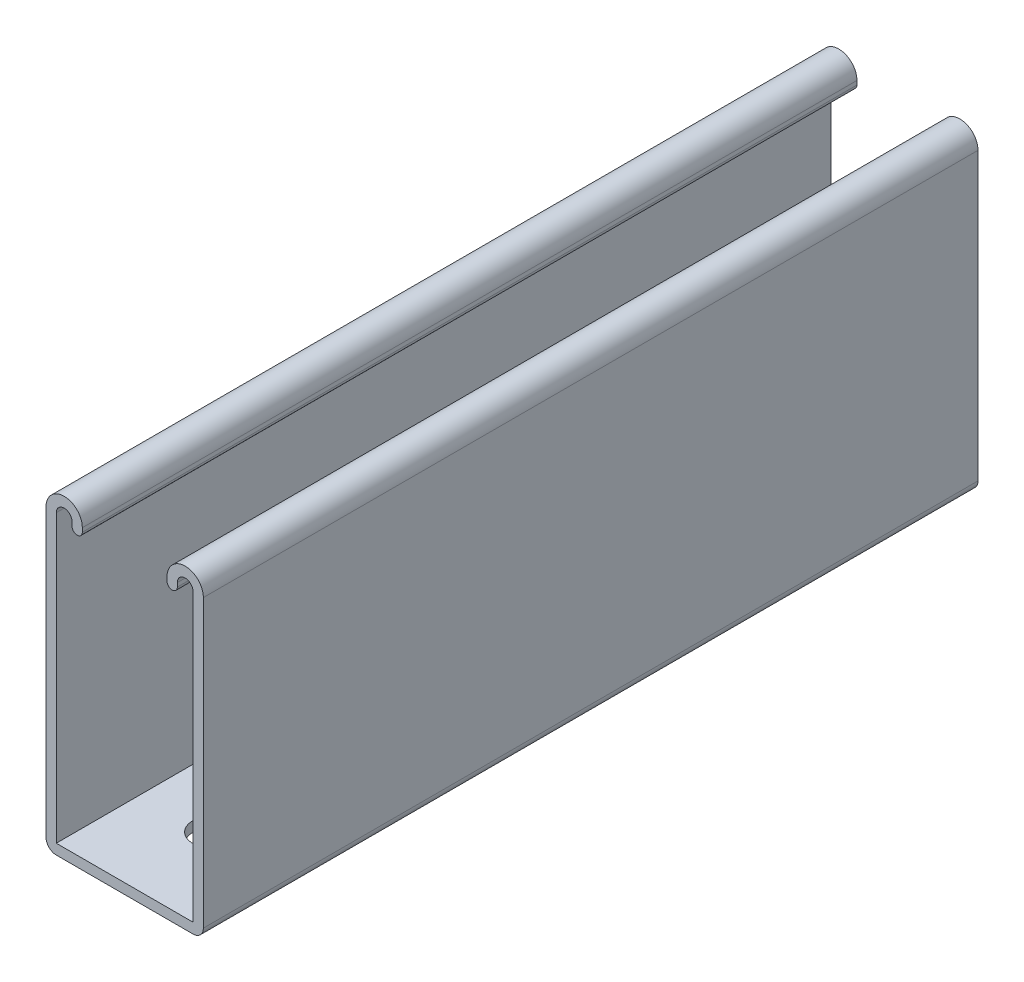
ISO-10303-21;
HEADER;
FILE_DESCRIPTION(('STEP AP214'),'2;1');
FILE_NAME('part.step','',(''),(''),'','','');
FILE_SCHEMA(('AUTOMOTIVE_DESIGN { 1 0 10303 214 1 1 1 1 }'));
ENDSEC;
DATA;
#1=APPLICATION_CONTEXT('core data for automotive mechanical design processes');
#2=APPLICATION_PROTOCOL_DEFINITION('international standard','automotive_design',2000,#1);
#3=PRODUCT_CONTEXT('',#1,'mechanical');
#4=PRODUCT('Part','Part','',(#3));
#5=PRODUCT_RELATED_PRODUCT_CATEGORY('part','',(#4));
#6=PRODUCT_DEFINITION_FORMATION('','',#4);
#7=PRODUCT_DEFINITION_CONTEXT('part definition',#1,'design');
#8=PRODUCT_DEFINITION('design','',#6,#7);
#9=PRODUCT_DEFINITION_SHAPE('','',#8);
#10=(LENGTH_UNIT() NAMED_UNIT(*) SI_UNIT(.MILLI.,.METRE.));
#11=(NAMED_UNIT(*) PLANE_ANGLE_UNIT() SI_UNIT($,.RADIAN.));
#12=(NAMED_UNIT(*) SI_UNIT($,.STERADIAN.) SOLID_ANGLE_UNIT());
#13=UNCERTAINTY_MEASURE_WITH_UNIT(LENGTH_MEASURE(1.E-05),#10,'distance_accuracy_value','');
#14=(GEOMETRIC_REPRESENTATION_CONTEXT(3) GLOBAL_UNCERTAINTY_ASSIGNED_CONTEXT((#13)) GLOBAL_UNIT_ASSIGNED_CONTEXT((#10,
#11,#12)) REPRESENTATION_CONTEXT('',''));
#15=CARTESIAN_POINT('',(0.,0.,0.));
#16=DIRECTION('',(0.,0.,1.));
#17=DIRECTION('',(1.,0.,0.));
#18=AXIS2_PLACEMENT_3D('',#15,#16,#17);
#19=CARTESIAN_POINT('',(-15.875,39.6875,203.2));
#20=DIRECTION('',(0.,0.,-1.));
#21=DIRECTION('',(-1.,0.,0.));
#22=AXIS2_PLACEMENT_3D('',#19,#20,#21);
#23=CYLINDRICAL_SURFACE('',#22,4.7625);
#24=CARTESIAN_POINT('',(-15.875,39.6875,0.));
#25=DIRECTION('',(0.,0.,1.));
#26=DIRECTION('',(-1.,0.,0.));
#27=AXIS2_PLACEMENT_3D('',#24,#25,#26);
#28=CIRCLE('',#27,4.7625);
#29=CARTESIAN_POINT('',(-11.1125,39.6875,0.));
#30=VERTEX_POINT('',#29);
#31=CARTESIAN_POINT('',(-20.6375,39.6875,0.));
#32=VERTEX_POINT('',#31);
#33=EDGE_CURVE('E253',#30,#32,#28,.T.);
#34=ORIENTED_EDGE('',*,*,#33,.T.);
#35=DIRECTION('',(0.,0.,-1.));
#36=VECTOR('',#35,1.);
#37=CARTESIAN_POINT('',(-20.6375,39.6875,203.2));
#38=LINE('',#37,#36);
#39=CARTESIAN_POINT('',(-20.6375,39.6875,203.2));
#40=VERTEX_POINT('',#39);
#41=EDGE_CURVE('E384',#40,#32,#38,.T.);
#42=ORIENTED_EDGE('',*,*,#41,.F.);
#43=CARTESIAN_POINT('',(-15.875,39.6875,203.2));
#44=DIRECTION('',(0.,0.,1.));
#45=DIRECTION('',(-1.,0.,0.));
#46=AXIS2_PLACEMENT_3D('',#43,#44,#45);
#47=CIRCLE('',#46,4.7625);
#48=CARTESIAN_POINT('',(-11.1125,39.6875,203.2));
#49=VERTEX_POINT('',#48);
#50=EDGE_CURVE('E260',#49,#40,#47,.T.);
#51=ORIENTED_EDGE('',*,*,#50,.F.);
#52=DIRECTION('',(0.,0.,-1.));
#53=VECTOR('',#52,1.);
#54=CARTESIAN_POINT('',(-11.1125,39.6875,203.2));
#55=LINE('',#54,#53);
#56=EDGE_CURVE('E298',#49,#30,#55,.T.);
#57=ORIENTED_EDGE('',*,*,#56,.T.);
#58=EDGE_LOOP('',(#34,#42,#51,#57));
#59=FACE_BOUND('',#58,.T.);
#60=ADVANCED_FACE('F32',(#59),#23,.T.);
#61=CARTESIAN_POINT('',(-20.6375,39.6875,203.2));
#62=DIRECTION('',(1.,0.,0.));
#63=DIRECTION('',(0.,1.,0.));
#64=AXIS2_PLACEMENT_3D('',#61,#62,#63);
#65=PLANE('',#64);
#66=DIRECTION('',(0.,-1.,0.));
#67=VECTOR('',#66,1.);
#68=CARTESIAN_POINT('',(-20.6375,39.6875,0.));
#69=LINE('',#68,#67);
#70=CARTESIAN_POINT('',(-20.6375,-35.4076,0.));
#71=VERTEX_POINT('',#70);
#72=EDGE_CURVE('E301',#32,#71,#69,.T.);
#73=ORIENTED_EDGE('',*,*,#72,.T.);
#74=DIRECTION('',(0.,0.,-1.));
#75=VECTOR('',#74,1.);
#76=CARTESIAN_POINT('',(-20.6375,-35.4076,203.2));
#77=LINE('',#76,#75);
#78=CARTESIAN_POINT('',(-20.6375,-35.4076,203.2));
#79=VERTEX_POINT('',#78);
#80=EDGE_CURVE('E381',#79,#71,#77,.T.);
#81=ORIENTED_EDGE('',*,*,#80,.F.);
#82=DIRECTION('',(0.,-1.,0.));
#83=VECTOR('',#82,1.);
#84=CARTESIAN_POINT('',(-20.6375,39.6875,203.2));
#85=LINE('',#84,#83);
#86=EDGE_CURVE('E263',#40,#79,#85,.T.);
#87=ORIENTED_EDGE('',*,*,#86,.F.);
#88=ORIENTED_EDGE('',*,*,#41,.T.);
#89=EDGE_LOOP('',(#73,#81,#87,#88));
#90=FACE_BOUND('',#89,.T.);
#91=ADVANCED_FACE('F425',(#90),#65,.F.);
#92=CARTESIAN_POINT('',(-17.9451,-35.4076,203.2));
#93=DIRECTION('',(0.,0.,-1.));
#94=DIRECTION('',(-1.,0.,0.));
#95=AXIS2_PLACEMENT_3D('',#92,#93,#94);
#96=CYLINDRICAL_SURFACE('',#95,2.6924);
#97=CARTESIAN_POINT('',(-17.9451,-35.4076,0.));
#98=DIRECTION('',(0.,0.,1.));
#99=DIRECTION('',(-1.,0.,0.));
#100=AXIS2_PLACEMENT_3D('',#97,#98,#99);
#101=CIRCLE('',#100,2.6924);
#102=CARTESIAN_POINT('',(-17.9451,-38.1,0.));
#103=VERTEX_POINT('',#102);
#104=EDGE_CURVE('E303',#71,#103,#101,.T.);
#105=ORIENTED_EDGE('',*,*,#104,.T.);
#106=DIRECTION('',(0.,0.,-1.));
#107=VECTOR('',#106,1.);
#108=CARTESIAN_POINT('',(-17.9451,-38.1,203.2));
#109=LINE('',#108,#107);
#110=CARTESIAN_POINT('',(-17.9451,-38.1,203.2));
#111=VERTEX_POINT('',#110);
#112=EDGE_CURVE('E378',#111,#103,#109,.T.);
#113=ORIENTED_EDGE('',*,*,#112,.F.);
#114=CARTESIAN_POINT('',(-17.9451,-35.4076,203.2));
#115=DIRECTION('',(0.,0.,1.));
#116=DIRECTION('',(-1.,0.,0.));
#117=AXIS2_PLACEMENT_3D('',#114,#115,#116);
#118=CIRCLE('',#117,2.6924);
#119=EDGE_CURVE('E266',#79,#111,#118,.T.);
#120=ORIENTED_EDGE('',*,*,#119,.F.);
#121=ORIENTED_EDGE('',*,*,#80,.T.);
#122=EDGE_LOOP('',(#105,#113,#120,#121));
#123=FACE_BOUND('',#122,.T.);
#124=ADVANCED_FACE('F430',(#123),#96,.T.);
#125=CARTESIAN_POINT('',(-17.9451,-38.1,203.2));
#126=DIRECTION('',(0.,1.,0.));
#127=DIRECTION('',(-1.,0.,0.));
#128=AXIS2_PLACEMENT_3D('',#125,#126,#127);
#129=PLANE('',#128);
#130=DIRECTION('',(0.,0.,-1.));
#131=VECTOR('',#130,1.);
#132=CARTESIAN_POINT('',(-5.15937500000001,-38.0999999999858,114.3));
#133=LINE('',#132,#131);
#134=CARTESIAN_POINT('',(-5.15937500000002,-38.1,180.18125));
#135=VERTEX_POINT('',#134);
#136=CARTESIAN_POINT('',(-5.15937500000001,-38.0999999999858,114.3));
#137=VERTEX_POINT('',#136);
#138=EDGE_CURVE('E206',#135,#137,#133,.T.);
#139=ORIENTED_EDGE('',*,*,#138,.F.);
#140=CARTESIAN_POINT('',(0.,-38.0999999999858,180.18125));
#141=DIRECTION('',(0.,-1.,0.));
#142=DIRECTION('',(1.,0.,0.));
#143=AXIS2_PLACEMENT_3D('',#140,#141,#142);
#144=CIRCLE('',#143,5.159375);
#145=CARTESIAN_POINT('',(5.15937499999999,-38.0999999999858,180.18125));
#146=VERTEX_POINT('',#145);
#147=EDGE_CURVE('E46',#146,#135,#144,.T.);
#148=ORIENTED_EDGE('',*,*,#147,.F.);
#149=DIRECTION('',(0.,0.,1.));
#150=VECTOR('',#149,1.);
#151=CARTESIAN_POINT('',(5.15937499999999,-38.0999999999858,180.18125));
#152=LINE('',#151,#150);
#153=CARTESIAN_POINT('',(5.159375,-38.0999999999858,114.3));
#154=VERTEX_POINT('',#153);
#155=EDGE_CURVE('E222',#154,#146,#152,.T.);
#156=ORIENTED_EDGE('',*,*,#155,.F.);
#157=CARTESIAN_POINT('',(0.,-38.0999999999858,114.3));
#158=DIRECTION('',(0.,-1.,0.));
#159=DIRECTION('',(1.,0.,0.));
#160=AXIS2_PLACEMENT_3D('',#157,#158,#159);
#161=CIRCLE('',#160,5.159375);
#162=EDGE_CURVE('E216',#137,#154,#161,.T.);
#163=ORIENTED_EDGE('',*,*,#162,.F.);
#164=EDGE_LOOP('',(#139,#148,#156,#163));
#165=FACE_BOUND('',#164,.T.);
#166=DIRECTION('',(0.,0.,-1.));
#167=VECTOR('',#166,1.);
#168=CARTESIAN_POINT('',(-5.15937500000001,-38.0999999999858,12.7));
#169=LINE('',#168,#167);
#170=CARTESIAN_POINT('',(-5.15937500000002,-38.1,78.58125));
#171=VERTEX_POINT('',#170);
#172=CARTESIAN_POINT('',(-5.15937500000001,-38.0999999999858,12.7));
#173=VERTEX_POINT('',#172);
#174=EDGE_CURVE('E241',#171,#173,#169,.T.);
#175=ORIENTED_EDGE('',*,*,#174,.F.);
#176=CARTESIAN_POINT('',(0.,-38.0999999999858,78.58125));
#177=DIRECTION('',(0.,-1.,0.));
#178=DIRECTION('',(1.,0.,0.));
#179=AXIS2_PLACEMENT_3D('',#176,#177,#178);
#180=CIRCLE('',#179,5.159375);
#181=CARTESIAN_POINT('',(5.15937499999999,-38.0999999999858,78.58125));
#182=VERTEX_POINT('',#181);
#183=EDGE_CURVE('E239',#182,#171,#180,.T.);
#184=ORIENTED_EDGE('',*,*,#183,.F.);
#185=DIRECTION('',(0.,0.,1.));
#186=VECTOR('',#185,1.);
#187=CARTESIAN_POINT('',(5.15937499999999,-38.0999999999858,78.58125));
#188=LINE('',#187,#186);
#189=CARTESIAN_POINT('',(5.159375,-38.0999999999858,12.7));
#190=VERTEX_POINT('',#189);
#191=EDGE_CURVE('E247',#190,#182,#188,.T.);
#192=ORIENTED_EDGE('',*,*,#191,.F.);
#193=CARTESIAN_POINT('',(0.,-38.0999999999858,12.7));
#194=DIRECTION('',(0.,-1.,0.));
#195=DIRECTION('',(1.,0.,0.));
#196=AXIS2_PLACEMENT_3D('',#193,#194,#195);
#197=CIRCLE('',#196,5.159375);
#198=EDGE_CURVE('E244',#173,#190,#197,.T.);
#199=ORIENTED_EDGE('',*,*,#198,.F.);
#200=EDGE_LOOP('',(#175,#184,#192,#199));
#201=FACE_BOUND('',#200,.T.);
#202=DIRECTION('',(1.,0.,0.));
#203=VECTOR('',#202,1.);
#204=CARTESIAN_POINT('',(-17.9451,-38.1,0.));
#205=LINE('',#204,#203);
#206=CARTESIAN_POINT('',(17.9451,-38.1,0.));
#207=VERTEX_POINT('',#206);
#208=EDGE_CURVE('E305',#103,#207,#205,.T.);
#209=ORIENTED_EDGE('',*,*,#208,.T.);
#210=DIRECTION('',(0.,0.,-1.));
#211=VECTOR('',#210,1.);
#212=CARTESIAN_POINT('',(17.9451,-38.1,203.2));
#213=LINE('',#212,#211);
#214=CARTESIAN_POINT('',(17.9451,-38.1,203.2));
#215=VERTEX_POINT('',#214);
#216=EDGE_CURVE('E375',#215,#207,#213,.T.);
#217=ORIENTED_EDGE('',*,*,#216,.F.);
#218=DIRECTION('',(1.,0.,0.));
#219=VECTOR('',#218,1.);
#220=CARTESIAN_POINT('',(-17.9451,-38.1,203.2));
#221=LINE('',#220,#219);
#222=EDGE_CURVE('E268',#111,#215,#221,.T.);
#223=ORIENTED_EDGE('',*,*,#222,.F.);
#224=ORIENTED_EDGE('',*,*,#112,.T.);
#225=EDGE_LOOP('',(#209,#217,#223,#224));
#226=FACE_BOUND('',#225,.T.);
#227=ADVANCED_FACE('F220',(#165,#201,#226),#129,.F.);
#228=CARTESIAN_POINT('',(17.9451,-35.4076,203.2));
#229=DIRECTION('',(0.,0.,-1.));
#230=DIRECTION('',(-1.,0.,0.));
#231=AXIS2_PLACEMENT_3D('',#228,#229,#230);
#232=CYLINDRICAL_SURFACE('',#231,2.6924);
#233=CARTESIAN_POINT('',(17.9451,-35.4076,0.));
#234=DIRECTION('',(0.,0.,1.));
#235=DIRECTION('',(1.,0.,0.));
#236=AXIS2_PLACEMENT_3D('',#233,#234,#235);
#237=CIRCLE('',#236,2.6924);
#238=CARTESIAN_POINT('',(20.6375,-35.4076,0.));
#239=VERTEX_POINT('',#238);
#240=EDGE_CURVE('E307',#207,#239,#237,.T.);
#241=ORIENTED_EDGE('',*,*,#240,.T.);
#242=DIRECTION('',(0.,0.,-1.));
#243=VECTOR('',#242,1.);
#244=CARTESIAN_POINT('',(20.6375,-35.4076,203.2));
#245=LINE('',#244,#243);
#246=CARTESIAN_POINT('',(20.6375,-35.4076,203.2));
#247=VERTEX_POINT('',#246);
#248=EDGE_CURVE('E372',#247,#239,#245,.T.);
#249=ORIENTED_EDGE('',*,*,#248,.F.);
#250=CARTESIAN_POINT('',(17.9451,-35.4076,203.2));
#251=DIRECTION('',(0.,0.,1.));
#252=DIRECTION('',(1.,0.,0.));
#253=AXIS2_PLACEMENT_3D('',#250,#251,#252);
#254=CIRCLE('',#253,2.6924);
#255=EDGE_CURVE('E270',#215,#247,#254,.T.);
#256=ORIENTED_EDGE('',*,*,#255,.F.);
#257=ORIENTED_EDGE('',*,*,#216,.T.);
#258=EDGE_LOOP('',(#241,#249,#256,#257));
#259=FACE_BOUND('',#258,.T.);
#260=ADVANCED_FACE('F510',(#259),#232,.T.);
#261=CARTESIAN_POINT('',(20.6375,-35.4076,203.2));
#262=DIRECTION('',(-1.,0.,0.));
#263=DIRECTION('',(0.,-1.,0.));
#264=AXIS2_PLACEMENT_3D('',#261,#262,#263);
#265=PLANE('',#264);
#266=DIRECTION('',(0.,1.,0.));
#267=VECTOR('',#266,1.);
#268=CARTESIAN_POINT('',(20.6375,-35.4076,0.));
#269=LINE('',#268,#267);
#270=CARTESIAN_POINT('',(20.6375,39.6875,0.));
#271=VERTEX_POINT('',#270);
#272=EDGE_CURVE('E309',#239,#271,#269,.T.);
#273=ORIENTED_EDGE('',*,*,#272,.T.);
#274=DIRECTION('',(0.,0.,-1.));
#275=VECTOR('',#274,1.);
#276=CARTESIAN_POINT('',(20.6375,39.6875,203.2));
#277=LINE('',#276,#275);
#278=CARTESIAN_POINT('',(20.6375,39.6875,203.2));
#279=VERTEX_POINT('',#278);
#280=EDGE_CURVE('E369',#279,#271,#277,.T.);
#281=ORIENTED_EDGE('',*,*,#280,.F.);
#282=DIRECTION('',(0.,1.,0.));
#283=VECTOR('',#282,1.);
#284=CARTESIAN_POINT('',(20.6375,-35.4076,203.2));
#285=LINE('',#284,#283);
#286=EDGE_CURVE('E272',#247,#279,#285,.T.);
#287=ORIENTED_EDGE('',*,*,#286,.F.);
#288=ORIENTED_EDGE('',*,*,#248,.T.);
#289=EDGE_LOOP('',(#273,#281,#287,#288));
#290=FACE_BOUND('',#289,.T.);
#291=ADVANCED_FACE('F506',(#290),#265,.F.);
#292=CARTESIAN_POINT('',(15.875,39.6875,203.2));
#293=DIRECTION('',(0.,0.,-1.));
#294=DIRECTION('',(-1.,0.,0.));
#295=AXIS2_PLACEMENT_3D('',#292,#293,#294);
#296=CYLINDRICAL_SURFACE('',#295,4.7625);
#297=CARTESIAN_POINT('',(15.875,39.6875,0.));
#298=DIRECTION('',(0.,0.,1.));
#299=DIRECTION('',(1.,0.,0.));
#300=AXIS2_PLACEMENT_3D('',#297,#298,#299);
#301=CIRCLE('',#300,4.7625);
#302=CARTESIAN_POINT('',(11.1125,39.6875,0.));
#303=VERTEX_POINT('',#302);
#304=EDGE_CURVE('E311',#271,#303,#301,.T.);
#305=ORIENTED_EDGE('',*,*,#304,.T.);
#306=DIRECTION('',(0.,0.,-1.));
#307=VECTOR('',#306,1.);
#308=CARTESIAN_POINT('',(11.1125,39.6875,203.2));
#309=LINE('',#308,#307);
#310=CARTESIAN_POINT('',(11.1125,39.6875,203.2));
#311=VERTEX_POINT('',#310);
#312=EDGE_CURVE('E366',#311,#303,#309,.T.);
#313=ORIENTED_EDGE('',*,*,#312,.F.);
#314=CARTESIAN_POINT('',(15.875,39.6875,203.2));
#315=DIRECTION('',(0.,0.,1.));
#316=DIRECTION('',(1.,0.,0.));
#317=AXIS2_PLACEMENT_3D('',#314,#315,#316);
#318=CIRCLE('',#317,4.7625);
#319=EDGE_CURVE('E274',#279,#311,#318,.T.);
#320=ORIENTED_EDGE('',*,*,#319,.F.);
#321=ORIENTED_EDGE('',*,*,#280,.T.);
#322=EDGE_LOOP('',(#305,#313,#320,#321));
#323=FACE_BOUND('',#322,.T.);
#324=ADVANCED_FACE('F501',(#323),#296,.T.);
#325=CARTESIAN_POINT('',(11.1125,39.6875,203.2));
#326=DIRECTION('',(1.,0.,0.));
#327=DIRECTION('',(0.,1.,0.));
#328=AXIS2_PLACEMENT_3D('',#325,#326,#327);
#329=PLANE('',#328);
#330=DIRECTION('',(0.,-1.,0.));
#331=VECTOR('',#330,1.);
#332=CARTESIAN_POINT('',(11.1125,39.6875,0.));
#333=LINE('',#332,#331);
#334=CARTESIAN_POINT('',(11.1125,38.65245,0.));
#335=VERTEX_POINT('',#334);
#336=EDGE_CURVE('E313',#303,#335,#333,.T.);
#337=ORIENTED_EDGE('',*,*,#336,.T.);
#338=DIRECTION('',(0.,0.,-1.));
#339=VECTOR('',#338,1.);
#340=CARTESIAN_POINT('',(11.1125,38.65245,203.2));
#341=LINE('',#340,#339);
#342=CARTESIAN_POINT('',(11.1125,38.65245,203.2));
#343=VERTEX_POINT('',#342);
#344=EDGE_CURVE('E363',#343,#335,#341,.T.);
#345=ORIENTED_EDGE('',*,*,#344,.F.);
#346=DIRECTION('',(0.,-1.,0.));
#347=VECTOR('',#346,1.);
#348=CARTESIAN_POINT('',(11.1125,39.6875,203.2));
#349=LINE('',#348,#347);
#350=EDGE_CURVE('E276',#311,#343,#349,.T.);
#351=ORIENTED_EDGE('',*,*,#350,.F.);
#352=ORIENTED_EDGE('',*,*,#312,.T.);
#353=EDGE_LOOP('',(#337,#345,#351,#352));
#354=FACE_BOUND('',#353,.T.);
#355=ADVANCED_FACE('F495',(#354),#329,.F.);
#356=CARTESIAN_POINT('',(12.4587,38.65245,203.2));
#357=DIRECTION('',(0.,0.,-1.));
#358=DIRECTION('',(-1.,0.,0.));
#359=AXIS2_PLACEMENT_3D('',#356,#357,#358);
#360=CYLINDRICAL_SURFACE('',#359,1.3462);
#361=CARTESIAN_POINT('',(12.4587,38.65245,0.));
#362=DIRECTION('',(0.,0.,1.));
#363=DIRECTION('',(1.,0.,0.));
#364=AXIS2_PLACEMENT_3D('',#361,#362,#363);
#365=CIRCLE('',#364,1.3462);
#366=CARTESIAN_POINT('',(13.8049,38.65245,0.));
#367=VERTEX_POINT('',#366);
#368=EDGE_CURVE('E315',#335,#367,#365,.T.);
#369=ORIENTED_EDGE('',*,*,#368,.T.);
#370=DIRECTION('',(0.,0.,-1.));
#371=VECTOR('',#370,1.);
#372=CARTESIAN_POINT('',(13.8049,38.65245,203.2));
#373=LINE('',#372,#371);
#374=CARTESIAN_POINT('',(13.8049,38.65245,203.2));
#375=VERTEX_POINT('',#374);
#376=EDGE_CURVE('E360',#375,#367,#373,.T.);
#377=ORIENTED_EDGE('',*,*,#376,.F.);
#378=CARTESIAN_POINT('',(12.4587,38.65245,203.2));
#379=DIRECTION('',(0.,0.,1.));
#380=DIRECTION('',(1.,0.,0.));
#381=AXIS2_PLACEMENT_3D('',#378,#379,#380);
#382=CIRCLE('',#381,1.3462);
#383=EDGE_CURVE('E278',#343,#375,#382,.T.);
#384=ORIENTED_EDGE('',*,*,#383,.F.);
#385=ORIENTED_EDGE('',*,*,#344,.T.);
#386=EDGE_LOOP('',(#369,#377,#384,#385));
#387=FACE_BOUND('',#386,.T.);
#388=ADVANCED_FACE('F491',(#387),#360,.T.);
#389=CARTESIAN_POINT('',(13.8049,39.6875,203.2));
#390=DIRECTION('',(-1.,0.,0.));
#391=DIRECTION('',(0.,0.,1.));
#392=AXIS2_PLACEMENT_3D('',#389,#390,#391);
#393=PLANE('',#392);
#394=DIRECTION('',(0.,1.,0.));
#395=VECTOR('',#394,1.);
#396=CARTESIAN_POINT('',(13.8049,39.6875,0.));
#397=LINE('',#396,#395);
#398=CARTESIAN_POINT('',(13.8049,39.6875,0.));
#399=VERTEX_POINT('',#398);
#400=EDGE_CURVE('E317',#367,#399,#397,.T.);
#401=ORIENTED_EDGE('',*,*,#400,.T.);
#402=DIRECTION('',(0.,0.,-1.));
#403=VECTOR('',#402,1.);
#404=CARTESIAN_POINT('',(13.8049,39.6875,203.2));
#405=LINE('',#404,#403);
#406=CARTESIAN_POINT('',(13.8049,39.6875,203.2));
#407=VERTEX_POINT('',#406);
#408=EDGE_CURVE('E357',#407,#399,#405,.T.);
#409=ORIENTED_EDGE('',*,*,#408,.F.);
#410=DIRECTION('',(0.,1.,0.));
#411=VECTOR('',#410,1.);
#412=CARTESIAN_POINT('',(13.8049,39.6875,203.2));
#413=LINE('',#412,#411);
#414=EDGE_CURVE('E280',#375,#407,#413,.T.);
#415=ORIENTED_EDGE('',*,*,#414,.F.);
#416=ORIENTED_EDGE('',*,*,#376,.T.);
#417=EDGE_LOOP('',(#401,#409,#415,#416));
#418=FACE_BOUND('',#417,.T.);
#419=ADVANCED_FACE('F486',(#418),#393,.F.);
#420=CARTESIAN_POINT('',(15.875,39.6875,203.2));
#421=DIRECTION('',(0.,0.,-1.));
#422=DIRECTION('',(-1.,0.,0.));
#423=AXIS2_PLACEMENT_3D('',#420,#421,#422);
#424=CYLINDRICAL_SURFACE('',#423,2.07010000000001);
#425=CARTESIAN_POINT('',(15.875,39.6875,0.));
#426=DIRECTION('',(0.,0.,-1.));
#427=DIRECTION('',(1.,0.,0.));
#428=AXIS2_PLACEMENT_3D('',#425,#426,#427);
#429=CIRCLE('',#428,2.07010000000001);
#430=CARTESIAN_POINT('',(17.9451,39.6875,0.));
#431=VERTEX_POINT('',#430);
#432=EDGE_CURVE('E319',#399,#431,#429,.T.);
#433=ORIENTED_EDGE('',*,*,#432,.T.);
#434=DIRECTION('',(0.,0.,-1.));
#435=VECTOR('',#434,1.);
#436=CARTESIAN_POINT('',(17.9451,39.6875,203.2));
#437=LINE('',#436,#435);
#438=CARTESIAN_POINT('',(17.9451,39.6875,203.2));
#439=VERTEX_POINT('',#438);
#440=EDGE_CURVE('E354',#439,#431,#437,.T.);
#441=ORIENTED_EDGE('',*,*,#440,.F.);
#442=CARTESIAN_POINT('',(15.875,39.6875,203.2));
#443=DIRECTION('',(0.,0.,-1.));
#444=DIRECTION('',(1.,0.,0.));
#445=AXIS2_PLACEMENT_3D('',#442,#443,#444);
#446=CIRCLE('',#445,2.07010000000001);
#447=EDGE_CURVE('E282',#407,#439,#446,.T.);
#448=ORIENTED_EDGE('',*,*,#447,.F.);
#449=ORIENTED_EDGE('',*,*,#408,.T.);
#450=EDGE_LOOP('',(#433,#441,#448,#449));
#451=FACE_BOUND('',#450,.T.);
#452=ADVANCED_FACE('F480',(#451),#424,.F.);
#453=CARTESIAN_POINT('',(17.9451,-35.4076,203.2));
#454=DIRECTION('',(1.,0.,0.));
#455=DIRECTION('',(0.,0.,-1.));
#456=AXIS2_PLACEMENT_3D('',#453,#454,#455);
#457=PLANE('',#456);
#458=DIRECTION('',(0.,-1.,0.));
#459=VECTOR('',#458,1.);
#460=CARTESIAN_POINT('',(17.9451,-35.4076,0.));
#461=LINE('',#460,#459);
#462=CARTESIAN_POINT('',(17.9451,-35.4076,0.));
#463=VERTEX_POINT('',#462);
#464=EDGE_CURVE('E321',#431,#463,#461,.T.);
#465=ORIENTED_EDGE('',*,*,#464,.T.);
#466=DIRECTION('',(0.,0.,-1.));
#467=VECTOR('',#466,1.);
#468=CARTESIAN_POINT('',(17.9451,-35.4076,203.2));
#469=LINE('',#468,#467);
#470=CARTESIAN_POINT('',(17.9451,-35.4076,203.2));
#471=VERTEX_POINT('',#470);
#472=EDGE_CURVE('E351',#471,#463,#469,.T.);
#473=ORIENTED_EDGE('',*,*,#472,.F.);
#474=DIRECTION('',(0.,-1.,0.));
#475=VECTOR('',#474,1.);
#476=CARTESIAN_POINT('',(17.9451,-35.4076,203.2));
#477=LINE('',#476,#475);
#478=EDGE_CURVE('E284',#439,#471,#477,.T.);
#479=ORIENTED_EDGE('',*,*,#478,.F.);
#480=ORIENTED_EDGE('',*,*,#440,.T.);
#481=EDGE_LOOP('',(#465,#473,#479,#480));
#482=FACE_BOUND('',#481,.T.);
#483=ADVANCED_FACE('F476',(#482),#457,.F.);
#484=CARTESIAN_POINT('',(-17.9451,-35.4076,203.2));
#485=DIRECTION('',(0.,-1.,0.));
#486=DIRECTION('',(0.,0.,-1.));
#487=AXIS2_PLACEMENT_3D('',#484,#485,#486);
#488=PLANE('',#487);
#489=DIRECTION('',(0.,0.,1.));
#490=VECTOR('',#489,1.);
#491=CARTESIAN_POINT('',(5.15937499999999,-35.4076,304.8));
#492=LINE('',#491,#490);
#493=CARTESIAN_POINT('',(5.159375,-35.4076,114.3));
#494=VERTEX_POINT('',#493);
#495=CARTESIAN_POINT('',(5.15937499999999,-35.4076,180.18125));
#496=VERTEX_POINT('',#495);
#497=EDGE_CURVE('E232',#494,#496,#492,.T.);
#498=ORIENTED_EDGE('',*,*,#497,.T.);
#499=CARTESIAN_POINT('',(0.,-35.4076,180.18125));
#500=DIRECTION('',(0.,-1.,0.));
#501=DIRECTION('',(0.,0.,-1.));
#502=AXIS2_PLACEMENT_3D('',#499,#500,#501);
#503=CIRCLE('',#502,5.159375);
#504=CARTESIAN_POINT('',(-5.15937500000002,-35.4076,180.18125));
#505=VERTEX_POINT('',#504);
#506=EDGE_CURVE('E236',#496,#505,#503,.T.);
#507=ORIENTED_EDGE('',*,*,#506,.T.);
#508=DIRECTION('',(0.,0.,-1.));
#509=VECTOR('',#508,1.);
#510=CARTESIAN_POINT('',(-5.15937500000003,-35.4076,304.8));
#511=LINE('',#510,#509);
#512=CARTESIAN_POINT('',(-5.15937500000001,-35.4076,114.3));
#513=VERTEX_POINT('',#512);
#514=EDGE_CURVE('E213',#505,#513,#511,.T.);
#515=ORIENTED_EDGE('',*,*,#514,.T.);
#516=CARTESIAN_POINT('',(0.,-35.4076,114.3));
#517=DIRECTION('',(0.,-1.,0.));
#518=DIRECTION('',(0.,0.,-1.));
#519=AXIS2_PLACEMENT_3D('',#516,#517,#518);
#520=CIRCLE('',#519,5.159375);
#521=EDGE_CURVE('E54',#513,#494,#520,.T.);
#522=ORIENTED_EDGE('',*,*,#521,.T.);
#523=EDGE_LOOP('',(#498,#507,#515,#522));
#524=FACE_BOUND('',#523,.T.);
#525=DIRECTION('',(0.,0.,1.));
#526=VECTOR('',#525,1.);
#527=CARTESIAN_POINT('',(5.15937499999999,-35.4076,203.2));
#528=LINE('',#527,#526);
#529=CARTESIAN_POINT('',(5.159375,-35.4076,12.7));
#530=VERTEX_POINT('',#529);
#531=CARTESIAN_POINT('',(5.15937499999999,-35.4076,78.58125));
#532=VERTEX_POINT('',#531);
#533=EDGE_CURVE('E39',#530,#532,#528,.T.);
#534=ORIENTED_EDGE('',*,*,#533,.T.);
#535=CARTESIAN_POINT('',(0.,-35.4076,78.58125));
#536=DIRECTION('',(0.,-1.,0.));
#537=DIRECTION('',(0.,0.,-1.));
#538=AXIS2_PLACEMENT_3D('',#535,#536,#537);
#539=CIRCLE('',#538,5.159375);
#540=CARTESIAN_POINT('',(-5.15937500000002,-35.4076,78.58125));
#541=VERTEX_POINT('',#540);
#542=EDGE_CURVE('E11',#532,#541,#539,.T.);
#543=ORIENTED_EDGE('',*,*,#542,.T.);
#544=DIRECTION('',(0.,0.,-1.));
#545=VECTOR('',#544,1.);
#546=CARTESIAN_POINT('',(-5.15937500000003,-35.4076,203.2));
#547=LINE('',#546,#545);
#548=CARTESIAN_POINT('',(-5.15937500000001,-35.4076,12.7));
#549=VERTEX_POINT('',#548);
#550=EDGE_CURVE('E387',#541,#549,#547,.T.);
#551=ORIENTED_EDGE('',*,*,#550,.T.);
#552=CARTESIAN_POINT('',(0.,-35.4076,12.7));
#553=DIRECTION('',(0.,-1.,0.));
#554=DIRECTION('',(0.,0.,-1.));
#555=AXIS2_PLACEMENT_3D('',#552,#553,#554);
#556=CIRCLE('',#555,5.159375);
#557=EDGE_CURVE('E390',#549,#530,#556,.T.);
#558=ORIENTED_EDGE('',*,*,#557,.T.);
#559=EDGE_LOOP('',(#534,#543,#551,#558));
#560=FACE_BOUND('',#559,.T.);
#561=DIRECTION('',(-1.,0.,0.));
#562=VECTOR('',#561,1.);
#563=CARTESIAN_POINT('',(-17.9451,-35.4076,0.));
#564=LINE('',#563,#562);
#565=CARTESIAN_POINT('',(-17.9451,-35.4076,0.));
#566=VERTEX_POINT('',#565);
#567=EDGE_CURVE('E323',#463,#566,#564,.T.);
#568=ORIENTED_EDGE('',*,*,#567,.T.);
#569=DIRECTION('',(0.,0.,-1.));
#570=VECTOR('',#569,1.);
#571=CARTESIAN_POINT('',(-17.9451,-35.4076,203.2));
#572=LINE('',#571,#570);
#573=CARTESIAN_POINT('',(-17.9451,-35.4076,203.2));
#574=VERTEX_POINT('',#573);
#575=EDGE_CURVE('E348',#574,#566,#572,.T.);
#576=ORIENTED_EDGE('',*,*,#575,.F.);
#577=DIRECTION('',(-1.,0.,0.));
#578=VECTOR('',#577,1.);
#579=CARTESIAN_POINT('',(-17.9451,-35.4076,203.2));
#580=LINE('',#579,#578);
#581=EDGE_CURVE('E286',#471,#574,#580,.T.);
#582=ORIENTED_EDGE('',*,*,#581,.F.);
#583=ORIENTED_EDGE('',*,*,#472,.T.);
#584=EDGE_LOOP('',(#568,#576,#582,#583));
#585=FACE_BOUND('',#584,.T.);
#586=ADVANCED_FACE('F394',(#524,#560,#585),#488,.F.);
#587=CARTESIAN_POINT('',(-17.9451,39.6875,203.2));
#588=DIRECTION('',(-1.,0.,0.));
#589=DIRECTION('',(0.,-1.,0.));
#590=AXIS2_PLACEMENT_3D('',#587,#588,#589);
#591=PLANE('',#590);
#592=DIRECTION('',(0.,1.,0.));
#593=VECTOR('',#592,1.);
#594=CARTESIAN_POINT('',(-17.9451,39.6875,0.));
#595=LINE('',#594,#593);
#596=CARTESIAN_POINT('',(-17.9451,39.6875,0.));
#597=VERTEX_POINT('',#596);
#598=EDGE_CURVE('E325',#566,#597,#595,.T.);
#599=ORIENTED_EDGE('',*,*,#598,.T.);
#600=DIRECTION('',(0.,0.,-1.));
#601=VECTOR('',#600,1.);
#602=CARTESIAN_POINT('',(-17.9451,39.6875,203.2));
#603=LINE('',#602,#601);
#604=CARTESIAN_POINT('',(-17.9451,39.6875,203.2));
#605=VERTEX_POINT('',#604);
#606=EDGE_CURVE('E345',#605,#597,#603,.T.);
#607=ORIENTED_EDGE('',*,*,#606,.F.);
#608=DIRECTION('',(0.,1.,0.));
#609=VECTOR('',#608,1.);
#610=CARTESIAN_POINT('',(-17.9451,39.6875,203.2));
#611=LINE('',#610,#609);
#612=EDGE_CURVE('E288',#574,#605,#611,.T.);
#613=ORIENTED_EDGE('',*,*,#612,.F.);
#614=ORIENTED_EDGE('',*,*,#575,.T.);
#615=EDGE_LOOP('',(#599,#607,#613,#614));
#616=FACE_BOUND('',#615,.T.);
#617=ADVANCED_FACE('F467',(#616),#591,.F.);
#618=CARTESIAN_POINT('',(-15.875,39.6875,203.2));
#619=DIRECTION('',(0.,0.,-1.));
#620=DIRECTION('',(-1.,0.,0.));
#621=AXIS2_PLACEMENT_3D('',#618,#619,#620);
#622=CYLINDRICAL_SURFACE('',#621,2.0701);
#623=CARTESIAN_POINT('',(-15.875,39.6875,0.));
#624=DIRECTION('',(0.,0.,-1.));
#625=DIRECTION('',(-1.,0.,0.));
#626=AXIS2_PLACEMENT_3D('',#623,#624,#625);
#627=CIRCLE('',#626,2.0701);
#628=CARTESIAN_POINT('',(-13.8049,39.6875,0.));
#629=VERTEX_POINT('',#628);
#630=EDGE_CURVE('E327',#597,#629,#627,.T.);
#631=ORIENTED_EDGE('',*,*,#630,.T.);
#632=DIRECTION('',(0.,0.,-1.));
#633=VECTOR('',#632,1.);
#634=CARTESIAN_POINT('',(-13.8049,39.6875,203.2));
#635=LINE('',#634,#633);
#636=CARTESIAN_POINT('',(-13.8049,39.6875,203.2));
#637=VERTEX_POINT('',#636);
#638=EDGE_CURVE('E342',#637,#629,#635,.T.);
#639=ORIENTED_EDGE('',*,*,#638,.F.);
#640=CARTESIAN_POINT('',(-15.875,39.6875,203.2));
#641=DIRECTION('',(0.,0.,-1.));
#642=DIRECTION('',(-1.,0.,0.));
#643=AXIS2_PLACEMENT_3D('',#640,#641,#642);
#644=CIRCLE('',#643,2.0701);
#645=EDGE_CURVE('E290',#605,#637,#644,.T.);
#646=ORIENTED_EDGE('',*,*,#645,.F.);
#647=ORIENTED_EDGE('',*,*,#606,.T.);
#648=EDGE_LOOP('',(#631,#639,#646,#647));
#649=FACE_BOUND('',#648,.T.);
#650=ADVANCED_FACE('F463',(#649),#622,.F.);
#651=CARTESIAN_POINT('',(-13.8049,39.6875,203.2));
#652=DIRECTION('',(1.,0.,0.));
#653=DIRECTION('',(0.,1.,0.));
#654=AXIS2_PLACEMENT_3D('',#651,#652,#653);
#655=PLANE('',#654);
#656=DIRECTION('',(0.,-1.,0.));
#657=VECTOR('',#656,1.);
#658=CARTESIAN_POINT('',(-13.8049,39.6875,0.));
#659=LINE('',#658,#657);
#660=CARTESIAN_POINT('',(-13.8049,38.65245,0.));
#661=VERTEX_POINT('',#660);
#662=EDGE_CURVE('E329',#629,#661,#659,.T.);
#663=ORIENTED_EDGE('',*,*,#662,.T.);
#664=DIRECTION('',(0.,0.,-1.));
#665=VECTOR('',#664,1.);
#666=CARTESIAN_POINT('',(-13.8049,38.65245,203.2));
#667=LINE('',#666,#665);
#668=CARTESIAN_POINT('',(-13.8049,38.65245,203.2));
#669=VERTEX_POINT('',#668);
#670=EDGE_CURVE('E339',#669,#661,#667,.T.);
#671=ORIENTED_EDGE('',*,*,#670,.F.);
#672=DIRECTION('',(0.,-1.,0.));
#673=VECTOR('',#672,1.);
#674=CARTESIAN_POINT('',(-13.8049,39.6875,203.2));
#675=LINE('',#674,#673);
#676=EDGE_CURVE('E292',#637,#669,#675,.T.);
#677=ORIENTED_EDGE('',*,*,#676,.F.);
#678=ORIENTED_EDGE('',*,*,#638,.T.);
#679=EDGE_LOOP('',(#663,#671,#677,#678));
#680=FACE_BOUND('',#679,.T.);
#681=ADVANCED_FACE('F458',(#680),#655,.F.);
#682=CARTESIAN_POINT('',(-12.4587,38.65245,203.2));
#683=DIRECTION('',(0.,0.,-1.));
#684=DIRECTION('',(-1.,0.,0.));
#685=AXIS2_PLACEMENT_3D('',#682,#683,#684);
#686=CYLINDRICAL_SURFACE('',#685,1.3462);
#687=CARTESIAN_POINT('',(-12.4587,38.65245,0.));
#688=DIRECTION('',(0.,0.,1.));
#689=DIRECTION('',(-1.,0.,0.));
#690=AXIS2_PLACEMENT_3D('',#687,#688,#689);
#691=CIRCLE('',#690,1.3462);
#692=CARTESIAN_POINT('',(-11.1125,38.65245,0.));
#693=VERTEX_POINT('',#692);
#694=EDGE_CURVE('E331',#661,#693,#691,.T.);
#695=ORIENTED_EDGE('',*,*,#694,.T.);
#696=DIRECTION('',(0.,0.,-1.));
#697=VECTOR('',#696,1.);
#698=CARTESIAN_POINT('',(-11.1125,38.65245,203.2));
#699=LINE('',#698,#697);
#700=CARTESIAN_POINT('',(-11.1125,38.65245,203.2));
#701=VERTEX_POINT('',#700);
#702=EDGE_CURVE('E336',#701,#693,#699,.T.);
#703=ORIENTED_EDGE('',*,*,#702,.F.);
#704=CARTESIAN_POINT('',(-12.4587,38.65245,203.2));
#705=DIRECTION('',(0.,0.,1.));
#706=DIRECTION('',(-1.,0.,0.));
#707=AXIS2_PLACEMENT_3D('',#704,#705,#706);
#708=CIRCLE('',#707,1.3462);
#709=EDGE_CURVE('E294',#669,#701,#708,.T.);
#710=ORIENTED_EDGE('',*,*,#709,.F.);
#711=ORIENTED_EDGE('',*,*,#670,.T.);
#712=EDGE_LOOP('',(#695,#703,#710,#711));
#713=FACE_BOUND('',#712,.T.);
#714=ADVANCED_FACE('F452',(#713),#686,.T.);
#715=CARTESIAN_POINT('',(-11.1125,39.6875,203.2));
#716=DIRECTION('',(-1.,0.,0.));
#717=DIRECTION('',(0.,-1.,0.));
#718=AXIS2_PLACEMENT_3D('',#715,#716,#717);
#719=PLANE('',#718);
#720=DIRECTION('',(0.,1.,0.));
#721=VECTOR('',#720,1.);
#722=CARTESIAN_POINT('',(-11.1125,39.6875,0.));
#723=LINE('',#722,#721);
#724=EDGE_CURVE('E264',#693,#30,#723,.T.);
#725=ORIENTED_EDGE('',*,*,#724,.T.);
#726=ORIENTED_EDGE('',*,*,#56,.F.);
#727=DIRECTION('',(0.,1.,0.));
#728=VECTOR('',#727,1.);
#729=CARTESIAN_POINT('',(-11.1125,39.6875,203.2));
#730=LINE('',#729,#728);
#731=EDGE_CURVE('E296',#701,#49,#730,.T.);
#732=ORIENTED_EDGE('',*,*,#731,.F.);
#733=ORIENTED_EDGE('',*,*,#702,.T.);
#734=EDGE_LOOP('',(#725,#726,#732,#733));
#735=FACE_BOUND('',#734,.T.);
#736=ADVANCED_FACE('F450',(#735),#719,.F.);
#737=CARTESIAN_POINT('',(-15.875,39.6875,203.2));
#738=DIRECTION('',(0.,0.,-1.));
#739=DIRECTION('',(-1.,0.,0.));
#740=AXIS2_PLACEMENT_3D('',#737,#738,#739);
#741=PLANE('',#740);
#742=ORIENTED_EDGE('',*,*,#50,.T.);
#743=ORIENTED_EDGE('',*,*,#86,.T.);
#744=ORIENTED_EDGE('',*,*,#119,.T.);
#745=ORIENTED_EDGE('',*,*,#222,.T.);
#746=ORIENTED_EDGE('',*,*,#255,.T.);
#747=ORIENTED_EDGE('',*,*,#286,.T.);
#748=ORIENTED_EDGE('',*,*,#319,.T.);
#749=ORIENTED_EDGE('',*,*,#350,.T.);
#750=ORIENTED_EDGE('',*,*,#383,.T.);
#751=ORIENTED_EDGE('',*,*,#414,.T.);
#752=ORIENTED_EDGE('',*,*,#447,.T.);
#753=ORIENTED_EDGE('',*,*,#478,.T.);
#754=ORIENTED_EDGE('',*,*,#581,.T.);
#755=ORIENTED_EDGE('',*,*,#612,.T.);
#756=ORIENTED_EDGE('',*,*,#645,.T.);
#757=ORIENTED_EDGE('',*,*,#676,.T.);
#758=ORIENTED_EDGE('',*,*,#709,.T.);
#759=ORIENTED_EDGE('',*,*,#731,.T.);
#760=EDGE_LOOP('',(#742,#743,#744,#745,#746,#747,#748,#749,#750,#751,#752,#753,#754,#755,#756,
#757,#758,#759));
#761=FACE_BOUND('',#760,.T.);
#762=ADVANCED_FACE('F445',(#761),#741,.F.);
#763=CARTESIAN_POINT('',(-15.875,39.6875,0.));
#764=DIRECTION('',(0.,0.,-1.));
#765=DIRECTION('',(-1.,0.,0.));
#766=AXIS2_PLACEMENT_3D('',#763,#764,#765);
#767=PLANE('',#766);
#768=ORIENTED_EDGE('',*,*,#33,.F.);
#769=ORIENTED_EDGE('',*,*,#724,.F.);
#770=ORIENTED_EDGE('',*,*,#694,.F.);
#771=ORIENTED_EDGE('',*,*,#662,.F.);
#772=ORIENTED_EDGE('',*,*,#630,.F.);
#773=ORIENTED_EDGE('',*,*,#598,.F.);
#774=ORIENTED_EDGE('',*,*,#567,.F.);
#775=ORIENTED_EDGE('',*,*,#464,.F.);
#776=ORIENTED_EDGE('',*,*,#432,.F.);
#777=ORIENTED_EDGE('',*,*,#400,.F.);
#778=ORIENTED_EDGE('',*,*,#368,.F.);
#779=ORIENTED_EDGE('',*,*,#336,.F.);
#780=ORIENTED_EDGE('',*,*,#304,.F.);
#781=ORIENTED_EDGE('',*,*,#272,.F.);
#782=ORIENTED_EDGE('',*,*,#240,.F.);
#783=ORIENTED_EDGE('',*,*,#208,.F.);
#784=ORIENTED_EDGE('',*,*,#104,.F.);
#785=ORIENTED_EDGE('',*,*,#72,.F.);
#786=EDGE_LOOP('',(#768,#769,#770,#771,#772,#773,#774,#775,#776,#777,#778,#779,#780,#781,#782,
#783,#784,#785));
#787=FACE_BOUND('',#786,.T.);
#788=ADVANCED_FACE('F438',(#787),#767,.T.);
#789=CARTESIAN_POINT('',(0.,44.45,78.58125));
#790=DIRECTION('',(0.,-1.,0.));
#791=DIRECTION('',(1.,0.,0.));
#792=AXIS2_PLACEMENT_3D('',#789,#790,#791);
#793=CYLINDRICAL_SURFACE('',#792,5.159375);
#794=DIRECTION('',(0.,-1.,0.));
#795=VECTOR('',#794,1.);
#796=CARTESIAN_POINT('',(5.15937500000001,44.45,78.58125));
#797=LINE('',#796,#795);
#798=EDGE_CURVE('E251',#532,#182,#797,.T.);
#799=ORIENTED_EDGE('',*,*,#798,.T.);
#800=ORIENTED_EDGE('',*,*,#183,.T.);
#801=DIRECTION('',(0.,-1.,0.));
#802=VECTOR('',#801,1.);
#803=CARTESIAN_POINT('',(-5.159375,44.45,78.58125));
#804=LINE('',#803,#802);
#805=EDGE_CURVE('E250',#541,#171,#804,.T.);
#806=ORIENTED_EDGE('',*,*,#805,.F.);
#807=ORIENTED_EDGE('',*,*,#542,.F.);
#808=EDGE_LOOP('',(#799,#800,#806,#807));
#809=FACE_BOUND('',#808,.T.);
#810=ADVANCED_FACE('F410',(#809),#793,.F.);
#811=CARTESIAN_POINT('',(5.15937500000001,44.45,78.58125));
#812=DIRECTION('',(1.,0.,0.));
#813=DIRECTION('',(0.,1.,0.));
#814=AXIS2_PLACEMENT_3D('',#811,#812,#813);
#815=PLANE('',#814);
#816=DIRECTION('',(0.,-1.,0.));
#817=VECTOR('',#816,1.);
#818=CARTESIAN_POINT('',(5.15937500000001,44.45,12.7));
#819=LINE('',#818,#817);
#820=EDGE_CURVE('E254',#530,#190,#819,.T.);
#821=ORIENTED_EDGE('',*,*,#820,.T.);
#822=ORIENTED_EDGE('',*,*,#191,.T.);
#823=ORIENTED_EDGE('',*,*,#798,.F.);
#824=ORIENTED_EDGE('',*,*,#533,.F.);
#825=EDGE_LOOP('',(#821,#822,#823,#824));
#826=FACE_BOUND('',#825,.T.);
#827=ADVANCED_FACE('F400',(#826),#815,.F.);
#828=CARTESIAN_POINT('',(0.,44.45,12.7));
#829=DIRECTION('',(0.,-1.,0.));
#830=DIRECTION('',(1.,0.,0.));
#831=AXIS2_PLACEMENT_3D('',#828,#829,#830);
#832=CYLINDRICAL_SURFACE('',#831,5.159375);
#833=DIRECTION('',(0.,-1.,0.));
#834=VECTOR('',#833,1.);
#835=CARTESIAN_POINT('',(-5.15937499999999,44.45,12.7));
#836=LINE('',#835,#834);
#837=EDGE_CURVE('E256',#549,#173,#836,.T.);
#838=ORIENTED_EDGE('',*,*,#837,.T.);
#839=ORIENTED_EDGE('',*,*,#198,.T.);
#840=ORIENTED_EDGE('',*,*,#820,.F.);
#841=ORIENTED_EDGE('',*,*,#557,.F.);
#842=EDGE_LOOP('',(#838,#839,#840,#841));
#843=FACE_BOUND('',#842,.T.);
#844=ADVANCED_FACE('F402',(#843),#832,.F.);
#845=CARTESIAN_POINT('',(-5.15937499999999,44.45,12.7));
#846=DIRECTION('',(-1.,0.,0.));
#847=DIRECTION('',(0.,-1.,0.));
#848=AXIS2_PLACEMENT_3D('',#845,#846,#847);
#849=PLANE('',#848);
#850=ORIENTED_EDGE('',*,*,#805,.T.);
#851=ORIENTED_EDGE('',*,*,#174,.T.);
#852=ORIENTED_EDGE('',*,*,#837,.F.);
#853=ORIENTED_EDGE('',*,*,#550,.F.);
#854=EDGE_LOOP('',(#850,#851,#852,#853));
#855=FACE_BOUND('',#854,.T.);
#856=ADVANCED_FACE('F412',(#855),#849,.F.);
#857=CARTESIAN_POINT('',(0.,44.45,180.18125));
#858=DIRECTION('',(0.,-1.,0.));
#859=DIRECTION('',(1.,0.,0.));
#860=AXIS2_PLACEMENT_3D('',#857,#858,#859);
#861=CYLINDRICAL_SURFACE('',#860,5.159375);
#862=DIRECTION('',(0.,-1.,0.));
#863=VECTOR('',#862,1.);
#864=CARTESIAN_POINT('',(5.15937500000001,44.45,180.18125));
#865=LINE('',#864,#863);
#866=EDGE_CURVE('E230',#496,#146,#865,.T.);
#867=ORIENTED_EDGE('',*,*,#866,.T.);
#868=ORIENTED_EDGE('',*,*,#147,.T.);
#869=DIRECTION('',(0.,-1.,0.));
#870=VECTOR('',#869,1.);
#871=CARTESIAN_POINT('',(-5.159375,44.45,180.18125));
#872=LINE('',#871,#870);
#873=EDGE_CURVE('E210',#505,#135,#872,.T.);
#874=ORIENTED_EDGE('',*,*,#873,.F.);
#875=ORIENTED_EDGE('',*,*,#506,.F.);
#876=EDGE_LOOP('',(#867,#868,#874,#875));
#877=FACE_BOUND('',#876,.T.);
#878=ADVANCED_FACE('F414',(#877),#861,.F.);
#879=CARTESIAN_POINT('',(5.15937500000001,44.45,180.18125));
#880=DIRECTION('',(1.,0.,0.));
#881=DIRECTION('',(0.,1.,0.));
#882=AXIS2_PLACEMENT_3D('',#879,#880,#881);
#883=PLANE('',#882);
#884=DIRECTION('',(0.,-1.,0.));
#885=VECTOR('',#884,1.);
#886=CARTESIAN_POINT('',(5.15937500000001,44.45,114.3));
#887=LINE('',#886,#885);
#888=EDGE_CURVE('E223',#494,#154,#887,.T.);
#889=ORIENTED_EDGE('',*,*,#888,.T.);
#890=ORIENTED_EDGE('',*,*,#155,.T.);
#891=ORIENTED_EDGE('',*,*,#866,.F.);
#892=ORIENTED_EDGE('',*,*,#497,.F.);
#893=EDGE_LOOP('',(#889,#890,#891,#892));
#894=FACE_BOUND('',#893,.T.);
#895=ADVANCED_FACE('F420',(#894),#883,.F.);
#896=CARTESIAN_POINT('',(0.,44.45,114.3));
#897=DIRECTION('',(0.,-1.,0.));
#898=DIRECTION('',(1.,0.,0.));
#899=AXIS2_PLACEMENT_3D('',#896,#897,#898);
#900=CYLINDRICAL_SURFACE('',#899,5.159375);
#901=DIRECTION('',(0.,-1.,0.));
#902=VECTOR('',#901,1.);
#903=CARTESIAN_POINT('',(-5.15937499999999,44.45,114.3));
#904=LINE('',#903,#902);
#905=EDGE_CURVE('E208',#513,#137,#904,.T.);
#906=ORIENTED_EDGE('',*,*,#905,.T.);
#907=ORIENTED_EDGE('',*,*,#162,.T.);
#908=ORIENTED_EDGE('',*,*,#888,.F.);
#909=ORIENTED_EDGE('',*,*,#521,.F.);
#910=EDGE_LOOP('',(#906,#907,#908,#909));
#911=FACE_BOUND('',#910,.T.);
#912=ADVANCED_FACE('F215',(#911),#900,.F.);
#913=CARTESIAN_POINT('',(-5.15937499999999,44.45,114.3));
#914=DIRECTION('',(-1.,0.,0.));
#915=DIRECTION('',(0.,-1.,0.));
#916=AXIS2_PLACEMENT_3D('',#913,#914,#915);
#917=PLANE('',#916);
#918=ORIENTED_EDGE('',*,*,#873,.T.);
#919=ORIENTED_EDGE('',*,*,#138,.T.);
#920=ORIENTED_EDGE('',*,*,#905,.F.);
#921=ORIENTED_EDGE('',*,*,#514,.F.);
#922=EDGE_LOOP('',(#918,#919,#920,#921));
#923=FACE_BOUND('',#922,.T.);
#924=ADVANCED_FACE('F207',(#923),#917,.F.);
#925=CLOSED_SHELL('',(#60,#91,#124,#227,#260,#291,#324,#355,#388,#419,#452,#483,#586,#617,#650,
#681,#714,#736,#762,#788,#810,#827,#844,#856,#878,#895,#912,#924));
#926=MANIFOLD_SOLID_BREP('B2',#925);
#927=ADVANCED_BREP_SHAPE_REPRESENTATION('',(#18,#926),#14);
#928=SHAPE_DEFINITION_REPRESENTATION(#9,#927);
ENDSEC;
END-ISO-10303-21;
